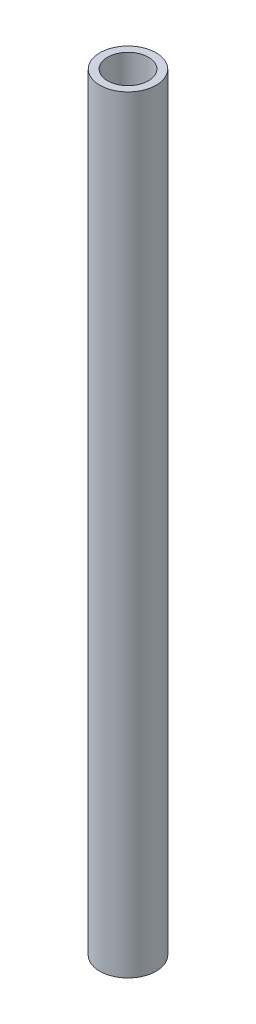
ISO-10303-21;
HEADER;
FILE_DESCRIPTION(('STEP AP214'),'2;1');
FILE_NAME('part.step','',(''),(''),'','','');
FILE_SCHEMA(('AUTOMOTIVE_DESIGN { 1 0 10303 214 1 1 1 1 }'));
ENDSEC;
DATA;
#1=APPLICATION_CONTEXT('core data for automotive mechanical design processes');
#2=APPLICATION_PROTOCOL_DEFINITION('international standard','automotive_design',2000,#1);
#3=PRODUCT_CONTEXT('',#1,'mechanical');
#4=PRODUCT('Part','Part','',(#3));
#5=PRODUCT_RELATED_PRODUCT_CATEGORY('part','',(#4));
#6=PRODUCT_DEFINITION_FORMATION('','',#4);
#7=PRODUCT_DEFINITION_CONTEXT('part definition',#1,'design');
#8=PRODUCT_DEFINITION('design','',#6,#7);
#9=PRODUCT_DEFINITION_SHAPE('','',#8);
#10=(LENGTH_UNIT() NAMED_UNIT(*) SI_UNIT(.MILLI.,.METRE.));
#11=(NAMED_UNIT(*) PLANE_ANGLE_UNIT() SI_UNIT($,.RADIAN.));
#12=(NAMED_UNIT(*) SI_UNIT($,.STERADIAN.) SOLID_ANGLE_UNIT());
#13=UNCERTAINTY_MEASURE_WITH_UNIT(LENGTH_MEASURE(1.E-05),#10,'distance_accuracy_value','');
#14=(GEOMETRIC_REPRESENTATION_CONTEXT(3) GLOBAL_UNCERTAINTY_ASSIGNED_CONTEXT((#13)) GLOBAL_UNIT_ASSIGNED_CONTEXT((#10,
#11,#12)) REPRESENTATION_CONTEXT('',''));
#15=CARTESIAN_POINT('',(0.,0.,0.));
#16=DIRECTION('',(0.,0.,1.));
#17=DIRECTION('',(1.,0.,0.));
#18=AXIS2_PLACEMENT_3D('',#15,#16,#17);
#19=CARTESIAN_POINT('',(0.,150.,0.));
#20=DIRECTION('',(0.,1.,0.));
#21=DIRECTION('',(0.,0.,1.));
#22=AXIS2_PLACEMENT_3D('',#19,#20,#21);
#23=PLANE('',#22);
#24=CARTESIAN_POINT('',(0.,150.,0.));
#25=DIRECTION('',(0.,1.,0.));
#26=DIRECTION('',(0.,0.,1.));
#27=AXIS2_PLACEMENT_3D('',#24,#25,#26);
#28=CIRCLE('',#27,5.5);
#29=CARTESIAN_POINT('',(0.,150.,5.5));
#30=VERTEX_POINT('',#29);
#31=EDGE_CURVE('E10',#30,#30,#28,.T.);
#32=ORIENTED_EDGE('',*,*,#31,.T.);
#33=EDGE_LOOP('',(#32));
#34=FACE_BOUND('',#33,.T.);
#35=CARTESIAN_POINT('',(0.,150.,0.));
#36=DIRECTION('',(0.,1.,0.));
#37=DIRECTION('',(0.,0.,1.));
#38=AXIS2_PLACEMENT_3D('',#35,#36,#37);
#39=CIRCLE('',#38,4.);
#40=CARTESIAN_POINT('',(0.,150.,4.));
#41=VERTEX_POINT('',#40);
#42=EDGE_CURVE('E42',#41,#41,#39,.T.);
#43=ORIENTED_EDGE('',*,*,#42,.F.);
#44=EDGE_LOOP('',(#43));
#45=FACE_BOUND('',#44,.T.);
#46=ADVANCED_FACE('F31',(#34,#45),#23,.T.);
#47=CARTESIAN_POINT('',(0.,0.,0.));
#48=DIRECTION('',(0.,1.,0.));
#49=DIRECTION('',(0.,0.,1.));
#50=AXIS2_PLACEMENT_3D('',#47,#48,#49);
#51=PLANE('',#50);
#52=CARTESIAN_POINT('',(0.,0.,0.));
#53=DIRECTION('',(0.,1.,0.));
#54=DIRECTION('',(0.,0.,1.));
#55=AXIS2_PLACEMENT_3D('',#52,#53,#54);
#56=CIRCLE('',#55,5.5);
#57=CARTESIAN_POINT('',(0.,0.,5.5));
#58=VERTEX_POINT('',#57);
#59=EDGE_CURVE('E35',#58,#58,#56,.T.);
#60=ORIENTED_EDGE('',*,*,#59,.F.);
#61=EDGE_LOOP('',(#60));
#62=FACE_BOUND('',#61,.T.);
#63=CARTESIAN_POINT('',(0.,0.,0.));
#64=DIRECTION('',(0.,1.,0.));
#65=DIRECTION('',(0.,0.,1.));
#66=AXIS2_PLACEMENT_3D('',#63,#64,#65);
#67=CIRCLE('',#66,4.);
#68=CARTESIAN_POINT('',(0.,0.,4.));
#69=VERTEX_POINT('',#68);
#70=EDGE_CURVE('E44',#69,#69,#67,.T.);
#71=ORIENTED_EDGE('',*,*,#70,.T.);
#72=EDGE_LOOP('',(#71));
#73=FACE_BOUND('',#72,.T.);
#74=ADVANCED_FACE('F54',(#62,#73),#51,.F.);
#75=CARTESIAN_POINT('',(0.,150.,0.));
#76=DIRECTION('',(0.,-1.,0.));
#77=DIRECTION('',(0.,0.,-1.));
#78=AXIS2_PLACEMENT_3D('',#75,#76,#77);
#79=CYLINDRICAL_SURFACE('',#78,5.5);
#80=ORIENTED_EDGE('',*,*,#31,.F.);
#81=EDGE_LOOP('',(#80));
#82=FACE_BOUND('',#81,.T.);
#83=ORIENTED_EDGE('',*,*,#59,.T.);
#84=EDGE_LOOP('',(#83));
#85=FACE_BOUND('',#84,.T.);
#86=ADVANCED_FACE('F33',(#82,#85),#79,.T.);
#87=CARTESIAN_POINT('',(0.,150.,0.));
#88=DIRECTION('',(0.,-1.,0.));
#89=DIRECTION('',(0.,0.,-1.));
#90=AXIS2_PLACEMENT_3D('',#87,#88,#89);
#91=CYLINDRICAL_SURFACE('',#90,4.);
#92=ORIENTED_EDGE('',*,*,#42,.T.);
#93=EDGE_LOOP('',(#92));
#94=FACE_BOUND('',#93,.T.);
#95=ORIENTED_EDGE('',*,*,#70,.F.);
#96=EDGE_LOOP('',(#95));
#97=FACE_BOUND('',#96,.T.);
#98=ADVANCED_FACE('F50',(#94,#97),#91,.F.);
#99=CLOSED_SHELL('',(#46,#74,#86,#98));
#100=MANIFOLD_SOLID_BREP('B2',#99);
#101=ADVANCED_BREP_SHAPE_REPRESENTATION('',(#18,#100),#14);
#102=SHAPE_DEFINITION_REPRESENTATION(#9,#101);
ENDSEC;
END-ISO-10303-21;
